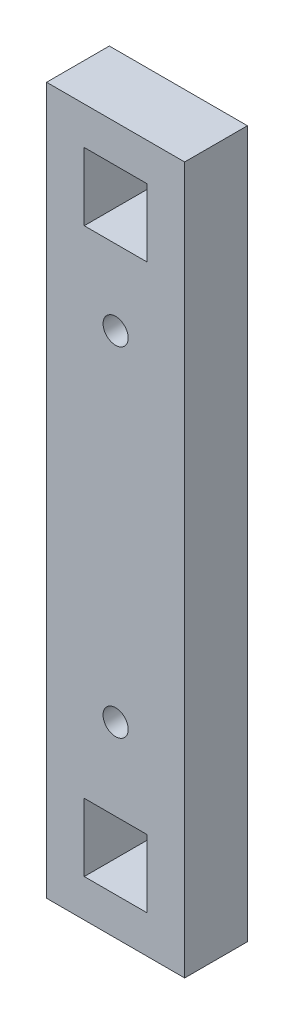
ISO-10303-21;
HEADER;
FILE_DESCRIPTION(('STEP AP214'),'2;1');
FILE_NAME('part.step','',(''),(''),'','','');
FILE_SCHEMA(('AUTOMOTIVE_DESIGN { 1 0 10303 214 1 1 1 1 }'));
ENDSEC;
DATA;
#1=APPLICATION_CONTEXT('core data for automotive mechanical design processes');
#2=APPLICATION_PROTOCOL_DEFINITION('international standard','automotive_design',2000,#1);
#3=PRODUCT_CONTEXT('',#1,'mechanical');
#4=PRODUCT('Part','Part','',(#3));
#5=PRODUCT_RELATED_PRODUCT_CATEGORY('part','',(#4));
#6=PRODUCT_DEFINITION_FORMATION('','',#4);
#7=PRODUCT_DEFINITION_CONTEXT('part definition',#1,'design');
#8=PRODUCT_DEFINITION('design','',#6,#7);
#9=PRODUCT_DEFINITION_SHAPE('','',#8);
#10=(LENGTH_UNIT() NAMED_UNIT(*) SI_UNIT(.MILLI.,.METRE.));
#11=(NAMED_UNIT(*) PLANE_ANGLE_UNIT() SI_UNIT($,.RADIAN.));
#12=(NAMED_UNIT(*) SI_UNIT($,.STERADIAN.) SOLID_ANGLE_UNIT());
#13=UNCERTAINTY_MEASURE_WITH_UNIT(LENGTH_MEASURE(1.E-05),#10,'distance_accuracy_value','');
#14=(GEOMETRIC_REPRESENTATION_CONTEXT(3) GLOBAL_UNCERTAINTY_ASSIGNED_CONTEXT((#13)) GLOBAL_UNIT_ASSIGNED_CONTEXT((#10,
#11,#12)) REPRESENTATION_CONTEXT('',''));
#15=CARTESIAN_POINT('',(0.,0.,0.));
#16=DIRECTION('',(0.,0.,1.));
#17=DIRECTION('',(1.,0.,0.));
#18=AXIS2_PLACEMENT_3D('',#15,#16,#17);
#19=CARTESIAN_POINT('',(0.,0.,5.));
#20=DIRECTION('',(0.,0.,1.));
#21=DIRECTION('',(1.,0.,0.));
#22=AXIS2_PLACEMENT_3D('',#19,#20,#21);
#23=PLANE('',#22);
#24=CARTESIAN_POINT('',(-1.48802211302211,0.659090909090931,5.));
#25=DIRECTION('',(0.,0.,1.));
#26=DIRECTION('',(1.,0.,0.));
#27=AXIS2_PLACEMENT_3D('',#24,#25,#26);
#28=CIRCLE('',#27,1.);
#29=CARTESIAN_POINT('',(-0.488022113022114,0.659090909090931,5.));
#30=VERTEX_POINT('',#29);
#31=EDGE_CURVE('E152',#30,#30,#28,.T.);
#32=ORIENTED_EDGE('',*,*,#31,.F.);
#33=EDGE_LOOP('',(#32));
#34=FACE_BOUND('',#33,.T.);
#35=DIRECTION('',(0.,-1.,0.));
#36=VECTOR('',#35,1.);
#37=CARTESIAN_POINT('',(-6.98802211302212,15.0590909090909,5.));
#38=LINE('',#37,#36);
#39=CARTESIAN_POINT('',(-6.98802211302212,15.0590909090909,5.));
#40=VERTEX_POINT('',#39);
#41=CARTESIAN_POINT('',(-6.98802211302211,-41.2409090909091,5.));
#42=VERTEX_POINT('',#41);
#43=EDGE_CURVE('E193',#40,#42,#38,.T.);
#44=ORIENTED_EDGE('',*,*,#43,.T.);
#45=DIRECTION('',(1.,0.,0.));
#46=VECTOR('',#45,1.);
#47=CARTESIAN_POINT('',(-6.98802211302211,-41.2409090909091,5.));
#48=LINE('',#47,#46);
#49=CARTESIAN_POINT('',(4.01197788697789,-41.2409090909091,5.));
#50=VERTEX_POINT('',#49);
#51=EDGE_CURVE('E196',#42,#50,#48,.T.);
#52=ORIENTED_EDGE('',*,*,#51,.T.);
#53=DIRECTION('',(0.,1.,0.));
#54=VECTOR('',#53,1.);
#55=CARTESIAN_POINT('',(4.01197788697788,15.0590909090909,5.));
#56=LINE('',#55,#54);
#57=CARTESIAN_POINT('',(4.01197788697788,15.0590909090909,5.));
#58=VERTEX_POINT('',#57);
#59=EDGE_CURVE('E199',#50,#58,#56,.T.);
#60=ORIENTED_EDGE('',*,*,#59,.T.);
#61=DIRECTION('',(-1.,0.,0.));
#62=VECTOR('',#61,1.);
#63=CARTESIAN_POINT('',(-6.98802211302212,15.0590909090909,5.));
#64=LINE('',#63,#62);
#65=EDGE_CURVE('E201',#58,#40,#64,.T.);
#66=ORIENTED_EDGE('',*,*,#65,.T.);
#67=EDGE_LOOP('',(#44,#52,#60,#66));
#68=FACE_BOUND('',#67,.T.);
#69=DIRECTION('',(1.,0.,0.));
#70=VECTOR('',#69,1.);
#71=CARTESIAN_POINT('',(-3.98802211302212,6.65909090909093,5.));
#72=LINE('',#71,#70);
#73=CARTESIAN_POINT('',(-3.98802211302212,6.65909090909093,5.));
#74=VERTEX_POINT('',#73);
#75=CARTESIAN_POINT('',(1.01197788697789,6.65909090909093,5.));
#76=VERTEX_POINT('',#75);
#77=EDGE_CURVE('E164',#74,#76,#72,.T.);
#78=ORIENTED_EDGE('',*,*,#77,.F.);
#79=DIRECTION('',(0.,-1.,0.));
#80=VECTOR('',#79,1.);
#81=CARTESIAN_POINT('',(-3.98802211302212,12.0590909090909,5.));
#82=LINE('',#81,#80);
#83=CARTESIAN_POINT('',(-3.98802211302212,12.0590909090909,5.));
#84=VERTEX_POINT('',#83);
#85=EDGE_CURVE('E162',#84,#74,#82,.T.);
#86=ORIENTED_EDGE('',*,*,#85,.F.);
#87=DIRECTION('',(-1.,0.,0.));
#88=VECTOR('',#87,1.);
#89=CARTESIAN_POINT('',(-3.98802211302212,12.0590909090909,5.));
#90=LINE('',#89,#88);
#91=CARTESIAN_POINT('',(1.01197788697788,12.0590909090909,5.));
#92=VERTEX_POINT('',#91);
#93=EDGE_CURVE('E170',#92,#84,#90,.T.);
#94=ORIENTED_EDGE('',*,*,#93,.F.);
#95=DIRECTION('',(0.,1.,0.));
#96=VECTOR('',#95,1.);
#97=CARTESIAN_POINT('',(1.01197788697788,12.0590909090909,5.));
#98=LINE('',#97,#96);
#99=EDGE_CURVE('E167',#76,#92,#98,.T.);
#100=ORIENTED_EDGE('',*,*,#99,.F.);
#101=EDGE_LOOP('',(#78,#86,#94,#100));
#102=FACE_BOUND('',#101,.T.);
#103=DIRECTION('',(1.,0.,0.));
#104=VECTOR('',#103,1.);
#105=CARTESIAN_POINT('',(-3.98802211302211,-38.2409090909091,5.));
#106=LINE('',#105,#104);
#107=CARTESIAN_POINT('',(-3.98802211302211,-38.2409090909091,5.));
#108=VERTEX_POINT('',#107);
#109=CARTESIAN_POINT('',(1.01197788697789,-38.2409090909091,5.));
#110=VERTEX_POINT('',#109);
#111=EDGE_CURVE('E131',#108,#110,#106,.T.);
#112=ORIENTED_EDGE('',*,*,#111,.F.);
#113=DIRECTION('',(0.,-1.,0.));
#114=VECTOR('',#113,1.);
#115=CARTESIAN_POINT('',(-3.98802211302211,-32.8409090909091,5.));
#116=LINE('',#115,#114);
#117=CARTESIAN_POINT('',(-3.98802211302211,-32.8409090909091,5.));
#118=VERTEX_POINT('',#117);
#119=EDGE_CURVE('E123',#118,#108,#116,.T.);
#120=ORIENTED_EDGE('',*,*,#119,.F.);
#121=DIRECTION('',(-1.,0.,0.));
#122=VECTOR('',#121,1.);
#123=CARTESIAN_POINT('',(-3.98802211302211,-32.8409090909091,5.));
#124=LINE('',#123,#122);
#125=CARTESIAN_POINT('',(1.01197788697789,-32.8409090909091,5.));
#126=VERTEX_POINT('',#125);
#127=EDGE_CURVE('E146',#126,#118,#124,.T.);
#128=ORIENTED_EDGE('',*,*,#127,.F.);
#129=DIRECTION('',(0.,1.,0.));
#130=VECTOR('',#129,1.);
#131=CARTESIAN_POINT('',(1.01197788697789,-32.8409090909091,5.));
#132=LINE('',#131,#130);
#133=EDGE_CURVE('E144',#110,#126,#132,.T.);
#134=ORIENTED_EDGE('',*,*,#133,.F.);
#135=EDGE_LOOP('',(#112,#120,#128,#134));
#136=FACE_BOUND('',#135,.T.);
#137=CARTESIAN_POINT('',(-1.48802211302211,-26.3409090909091,5.));
#138=DIRECTION('',(0.,0.,1.));
#139=DIRECTION('',(1.,0.,0.));
#140=AXIS2_PLACEMENT_3D('',#137,#138,#139);
#141=CIRCLE('',#140,1.);
#142=CARTESIAN_POINT('',(-0.48802211302211,-26.3409090909091,5.));
#143=VERTEX_POINT('',#142);
#144=EDGE_CURVE('E310',#143,#143,#141,.T.);
#145=ORIENTED_EDGE('',*,*,#144,.F.);
#146=EDGE_LOOP('',(#145));
#147=FACE_BOUND('',#146,.T.);
#148=ADVANCED_FACE('F34',(#34,#68,#102,#136,#147),#23,.T.);
#149=CARTESIAN_POINT('',(0.,0.,0.));
#150=DIRECTION('',(0.,0.,1.));
#151=DIRECTION('',(1.,0.,0.));
#152=AXIS2_PLACEMENT_3D('',#149,#150,#151);
#153=PLANE('',#152);
#154=DIRECTION('',(0.,-1.,0.));
#155=VECTOR('',#154,1.);
#156=CARTESIAN_POINT('',(-3.98802211302212,12.0590909090909,0.));
#157=LINE('',#156,#155);
#158=CARTESIAN_POINT('',(-3.98802211302212,12.0590909090909,0.));
#159=VERTEX_POINT('',#158);
#160=CARTESIAN_POINT('',(-3.98802211302212,6.65909090909093,0.));
#161=VERTEX_POINT('',#160);
#162=EDGE_CURVE('E139',#159,#161,#157,.T.);
#163=ORIENTED_EDGE('',*,*,#162,.T.);
#164=DIRECTION('',(1.,0.,0.));
#165=VECTOR('',#164,1.);
#166=CARTESIAN_POINT('',(-3.98802211302212,6.65909090909093,0.));
#167=LINE('',#166,#165);
#168=CARTESIAN_POINT('',(1.01197788697789,6.65909090909093,0.));
#169=VERTEX_POINT('',#168);
#170=EDGE_CURVE('E175',#161,#169,#167,.T.);
#171=ORIENTED_EDGE('',*,*,#170,.T.);
#172=DIRECTION('',(0.,1.,0.));
#173=VECTOR('',#172,1.);
#174=CARTESIAN_POINT('',(1.01197788697788,12.0590909090909,0.));
#175=LINE('',#174,#173);
#176=CARTESIAN_POINT('',(1.01197788697788,12.0590909090909,0.));
#177=VERTEX_POINT('',#176);
#178=EDGE_CURVE('E178',#169,#177,#175,.T.);
#179=ORIENTED_EDGE('',*,*,#178,.T.);
#180=DIRECTION('',(-1.,0.,0.));
#181=VECTOR('',#180,1.);
#182=CARTESIAN_POINT('',(-3.98802211302212,12.0590909090909,0.));
#183=LINE('',#182,#181);
#184=EDGE_CURVE('E165',#177,#159,#183,.T.);
#185=ORIENTED_EDGE('',*,*,#184,.T.);
#186=EDGE_LOOP('',(#163,#171,#179,#185));
#187=FACE_BOUND('',#186,.T.);
#188=DIRECTION('',(0.,-1.,0.));
#189=VECTOR('',#188,1.);
#190=CARTESIAN_POINT('',(-6.98802211302212,15.0590909090909,0.));
#191=LINE('',#190,#189);
#192=CARTESIAN_POINT('',(-6.98802211302212,15.0590909090909,0.));
#193=VERTEX_POINT('',#192);
#194=CARTESIAN_POINT('',(-6.98802211302211,-41.2409090909091,0.));
#195=VERTEX_POINT('',#194);
#196=EDGE_CURVE('E192',#193,#195,#191,.T.);
#197=ORIENTED_EDGE('',*,*,#196,.F.);
#198=DIRECTION('',(-1.,0.,0.));
#199=VECTOR('',#198,1.);
#200=CARTESIAN_POINT('',(-6.98802211302212,15.0590909090909,0.));
#201=LINE('',#200,#199);
#202=CARTESIAN_POINT('',(4.01197788697788,15.0590909090909,0.));
#203=VERTEX_POINT('',#202);
#204=EDGE_CURVE('E197',#203,#193,#201,.T.);
#205=ORIENTED_EDGE('',*,*,#204,.F.);
#206=DIRECTION('',(0.,1.,0.));
#207=VECTOR('',#206,1.);
#208=CARTESIAN_POINT('',(4.01197788697788,15.0590909090909,0.));
#209=LINE('',#208,#207);
#210=CARTESIAN_POINT('',(4.01197788697789,-41.2409090909091,0.));
#211=VERTEX_POINT('',#210);
#212=EDGE_CURVE('E208',#211,#203,#209,.T.);
#213=ORIENTED_EDGE('',*,*,#212,.F.);
#214=DIRECTION('',(1.,0.,0.));
#215=VECTOR('',#214,1.);
#216=CARTESIAN_POINT('',(-6.98802211302211,-41.2409090909091,0.));
#217=LINE('',#216,#215);
#218=EDGE_CURVE('E206',#195,#211,#217,.T.);
#219=ORIENTED_EDGE('',*,*,#218,.F.);
#220=EDGE_LOOP('',(#197,#205,#213,#219));
#221=FACE_BOUND('',#220,.T.);
#222=DIRECTION('',(0.,-1.,0.));
#223=VECTOR('',#222,1.);
#224=CARTESIAN_POINT('',(-3.98802211302211,-32.8409090909091,0.));
#225=LINE('',#224,#223);
#226=CARTESIAN_POINT('',(-3.98802211302211,-32.8409090909091,0.));
#227=VERTEX_POINT('',#226);
#228=CARTESIAN_POINT('',(-3.98802211302211,-38.2409090909091,0.));
#229=VERTEX_POINT('',#228);
#230=EDGE_CURVE('E57',#227,#229,#225,.T.);
#231=ORIENTED_EDGE('',*,*,#230,.T.);
#232=DIRECTION('',(1.,0.,0.));
#233=VECTOR('',#232,1.);
#234=CARTESIAN_POINT('',(-3.98802211302211,-38.2409090909091,0.));
#235=LINE('',#234,#233);
#236=CARTESIAN_POINT('',(1.01197788697789,-38.2409090909091,0.));
#237=VERTEX_POINT('',#236);
#238=EDGE_CURVE('E138',#229,#237,#235,.T.);
#239=ORIENTED_EDGE('',*,*,#238,.T.);
#240=DIRECTION('',(0.,1.,0.));
#241=VECTOR('',#240,1.);
#242=CARTESIAN_POINT('',(1.01197788697789,-32.8409090909091,0.));
#243=LINE('',#242,#241);
#244=CARTESIAN_POINT('',(1.01197788697789,-32.8409090909091,0.));
#245=VERTEX_POINT('',#244);
#246=EDGE_CURVE('E154',#237,#245,#243,.T.);
#247=ORIENTED_EDGE('',*,*,#246,.T.);
#248=DIRECTION('',(-1.,0.,0.));
#249=VECTOR('',#248,1.);
#250=CARTESIAN_POINT('',(-3.98802211302211,-32.8409090909091,0.));
#251=LINE('',#250,#249);
#252=EDGE_CURVE('E132',#245,#227,#251,.T.);
#253=ORIENTED_EDGE('',*,*,#252,.T.);
#254=EDGE_LOOP('',(#231,#239,#247,#253));
#255=FACE_BOUND('',#254,.T.);
#256=CARTESIAN_POINT('',(-1.48802211302211,0.659090909090931,0.));
#257=DIRECTION('',(0.,0.,1.));
#258=DIRECTION('',(1.,0.,0.));
#259=AXIS2_PLACEMENT_3D('',#256,#257,#258);
#260=CIRCLE('',#259,1.);
#261=CARTESIAN_POINT('',(-0.488022113022114,0.659090909090931,0.));
#262=VERTEX_POINT('',#261);
#263=EDGE_CURVE('E316',#262,#262,#260,.T.);
#264=ORIENTED_EDGE('',*,*,#263,.T.);
#265=EDGE_LOOP('',(#264));
#266=FACE_BOUND('',#265,.T.);
#267=CARTESIAN_POINT('',(-1.48802211302211,-26.3409090909091,0.));
#268=DIRECTION('',(0.,0.,1.));
#269=DIRECTION('',(1.,0.,0.));
#270=AXIS2_PLACEMENT_3D('',#267,#268,#269);
#271=CIRCLE('',#270,1.);
#272=CARTESIAN_POINT('',(-0.48802211302211,-26.3409090909091,0.));
#273=VERTEX_POINT('',#272);
#274=EDGE_CURVE('E313',#273,#273,#271,.T.);
#275=ORIENTED_EDGE('',*,*,#274,.T.);
#276=EDGE_LOOP('',(#275));
#277=FACE_BOUND('',#276,.T.);
#278=ADVANCED_FACE('F226',(#187,#221,#255,#266,#277),#153,.F.);
#279=CARTESIAN_POINT('',(-6.98802211302212,15.0590909090909,5.));
#280=DIRECTION('',(1.,0.,0.));
#281=DIRECTION('',(0.,1.,0.));
#282=AXIS2_PLACEMENT_3D('',#279,#280,#281);
#283=PLANE('',#282);
#284=ORIENTED_EDGE('',*,*,#196,.T.);
#285=DIRECTION('',(0.,0.,-1.));
#286=VECTOR('',#285,1.);
#287=CARTESIAN_POINT('',(-6.98802211302211,-41.2409090909091,5.));
#288=LINE('',#287,#286);
#289=EDGE_CURVE('E11',#42,#195,#288,.T.);
#290=ORIENTED_EDGE('',*,*,#289,.F.);
#291=ORIENTED_EDGE('',*,*,#43,.F.);
#292=DIRECTION('',(0.,0.,-1.));
#293=VECTOR('',#292,1.);
#294=CARTESIAN_POINT('',(-6.98802211302212,15.0590909090909,5.));
#295=LINE('',#294,#293);
#296=EDGE_CURVE('E203',#40,#193,#295,.T.);
#297=ORIENTED_EDGE('',*,*,#296,.T.);
#298=EDGE_LOOP('',(#284,#290,#291,#297));
#299=FACE_BOUND('',#298,.T.);
#300=ADVANCED_FACE('F36',(#299),#283,.F.);
#301=CARTESIAN_POINT('',(-6.98802211302211,-41.2409090909091,5.));
#302=DIRECTION('',(0.,1.,0.));
#303=DIRECTION('',(0.,0.,1.));
#304=AXIS2_PLACEMENT_3D('',#301,#302,#303);
#305=PLANE('',#304);
#306=ORIENTED_EDGE('',*,*,#218,.T.);
#307=DIRECTION('',(0.,0.,-1.));
#308=VECTOR('',#307,1.);
#309=CARTESIAN_POINT('',(4.01197788697789,-41.2409090909091,5.));
#310=LINE('',#309,#308);
#311=EDGE_CURVE('E42',#50,#211,#310,.T.);
#312=ORIENTED_EDGE('',*,*,#311,.F.);
#313=ORIENTED_EDGE('',*,*,#51,.F.);
#314=ORIENTED_EDGE('',*,*,#289,.T.);
#315=EDGE_LOOP('',(#306,#312,#313,#314));
#316=FACE_BOUND('',#315,.T.);
#317=ADVANCED_FACE('F237',(#316),#305,.F.);
#318=CARTESIAN_POINT('',(4.01197788697788,15.0590909090909,5.));
#319=DIRECTION('',(-1.,0.,0.));
#320=DIRECTION('',(0.,-1.,0.));
#321=AXIS2_PLACEMENT_3D('',#318,#319,#320);
#322=PLANE('',#321);
#323=ORIENTED_EDGE('',*,*,#212,.T.);
#324=DIRECTION('',(0.,0.,-1.));
#325=VECTOR('',#324,1.);
#326=CARTESIAN_POINT('',(4.01197788697788,15.0590909090909,5.));
#327=LINE('',#326,#325);
#328=EDGE_CURVE('E213',#58,#203,#327,.T.);
#329=ORIENTED_EDGE('',*,*,#328,.F.);
#330=ORIENTED_EDGE('',*,*,#59,.F.);
#331=ORIENTED_EDGE('',*,*,#311,.T.);
#332=EDGE_LOOP('',(#323,#329,#330,#331));
#333=FACE_BOUND('',#332,.T.);
#334=ADVANCED_FACE('F220',(#333),#322,.F.);
#335=CARTESIAN_POINT('',(-6.98802211302212,15.0590909090909,5.));
#336=DIRECTION('',(0.,-1.,0.));
#337=DIRECTION('',(0.,0.,-1.));
#338=AXIS2_PLACEMENT_3D('',#335,#336,#337);
#339=PLANE('',#338);
#340=ORIENTED_EDGE('',*,*,#204,.T.);
#341=ORIENTED_EDGE('',*,*,#296,.F.);
#342=ORIENTED_EDGE('',*,*,#65,.F.);
#343=ORIENTED_EDGE('',*,*,#328,.T.);
#344=EDGE_LOOP('',(#340,#341,#342,#343));
#345=FACE_BOUND('',#344,.T.);
#346=ADVANCED_FACE('F230',(#345),#339,.F.);
#347=CARTESIAN_POINT('',(-3.98802211302212,12.0590909090909,5.));
#348=DIRECTION('',(1.,0.,0.));
#349=DIRECTION('',(0.,1.,0.));
#350=AXIS2_PLACEMENT_3D('',#347,#348,#349);
#351=PLANE('',#350);
#352=ORIENTED_EDGE('',*,*,#162,.F.);
#353=DIRECTION('',(0.,0.,-1.));
#354=VECTOR('',#353,1.);
#355=CARTESIAN_POINT('',(-3.98802211302212,12.0590909090909,5.));
#356=LINE('',#355,#354);
#357=EDGE_CURVE('E172',#84,#159,#356,.T.);
#358=ORIENTED_EDGE('',*,*,#357,.F.);
#359=ORIENTED_EDGE('',*,*,#85,.T.);
#360=DIRECTION('',(0.,0.,-1.));
#361=VECTOR('',#360,1.);
#362=CARTESIAN_POINT('',(-3.98802211302212,6.65909090909093,5.));
#363=LINE('',#362,#361);
#364=EDGE_CURVE('E189',#74,#161,#363,.T.);
#365=ORIENTED_EDGE('',*,*,#364,.T.);
#366=EDGE_LOOP('',(#352,#358,#359,#365));
#367=FACE_BOUND('',#366,.T.);
#368=ADVANCED_FACE('F254',(#367),#351,.T.);
#369=CARTESIAN_POINT('',(-3.98802211302212,6.65909090909093,5.));
#370=DIRECTION('',(0.,1.,0.));
#371=DIRECTION('',(0.,0.,1.));
#372=AXIS2_PLACEMENT_3D('',#369,#370,#371);
#373=PLANE('',#372);
#374=ORIENTED_EDGE('',*,*,#170,.F.);
#375=ORIENTED_EDGE('',*,*,#364,.F.);
#376=ORIENTED_EDGE('',*,*,#77,.T.);
#377=DIRECTION('',(0.,0.,-1.));
#378=VECTOR('',#377,1.);
#379=CARTESIAN_POINT('',(1.01197788697789,6.65909090909093,5.));
#380=LINE('',#379,#378);
#381=EDGE_CURVE('E187',#76,#169,#380,.T.);
#382=ORIENTED_EDGE('',*,*,#381,.T.);
#383=EDGE_LOOP('',(#374,#375,#376,#382));
#384=FACE_BOUND('',#383,.T.);
#385=ADVANCED_FACE('F261',(#384),#373,.T.);
#386=CARTESIAN_POINT('',(1.01197788697788,12.0590909090909,5.));
#387=DIRECTION('',(-1.,0.,0.));
#388=DIRECTION('',(0.,-1.,0.));
#389=AXIS2_PLACEMENT_3D('',#386,#387,#388);
#390=PLANE('',#389);
#391=ORIENTED_EDGE('',*,*,#178,.F.);
#392=ORIENTED_EDGE('',*,*,#381,.F.);
#393=ORIENTED_EDGE('',*,*,#99,.T.);
#394=DIRECTION('',(0.,0.,-1.));
#395=VECTOR('',#394,1.);
#396=CARTESIAN_POINT('',(1.01197788697788,12.0590909090909,5.));
#397=LINE('',#396,#395);
#398=EDGE_CURVE('E185',#92,#177,#397,.T.);
#399=ORIENTED_EDGE('',*,*,#398,.T.);
#400=EDGE_LOOP('',(#391,#392,#393,#399));
#401=FACE_BOUND('',#400,.T.);
#402=ADVANCED_FACE('F266',(#401),#390,.T.);
#403=CARTESIAN_POINT('',(-3.98802211302212,12.0590909090909,5.));
#404=DIRECTION('',(0.,-1.,0.));
#405=DIRECTION('',(0.,0.,-1.));
#406=AXIS2_PLACEMENT_3D('',#403,#404,#405);
#407=PLANE('',#406);
#408=ORIENTED_EDGE('',*,*,#184,.F.);
#409=ORIENTED_EDGE('',*,*,#398,.F.);
#410=ORIENTED_EDGE('',*,*,#93,.T.);
#411=ORIENTED_EDGE('',*,*,#357,.T.);
#412=EDGE_LOOP('',(#408,#409,#410,#411));
#413=FACE_BOUND('',#412,.T.);
#414=ADVANCED_FACE('F273',(#413),#407,.T.);
#415=CARTESIAN_POINT('',(-3.98802211302211,-32.8409090909091,5.));
#416=DIRECTION('',(1.,0.,0.));
#417=DIRECTION('',(0.,1.,0.));
#418=AXIS2_PLACEMENT_3D('',#415,#416,#417);
#419=PLANE('',#418);
#420=ORIENTED_EDGE('',*,*,#230,.F.);
#421=DIRECTION('',(0.,0.,-1.));
#422=VECTOR('',#421,1.);
#423=CARTESIAN_POINT('',(-3.98802211302211,-32.8409090909091,5.));
#424=LINE('',#423,#422);
#425=EDGE_CURVE('E127',#118,#227,#424,.T.);
#426=ORIENTED_EDGE('',*,*,#425,.F.);
#427=ORIENTED_EDGE('',*,*,#119,.T.);
#428=DIRECTION('',(0.,0.,-1.));
#429=VECTOR('',#428,1.);
#430=CARTESIAN_POINT('',(-3.98802211302211,-38.2409090909091,5.));
#431=LINE('',#430,#429);
#432=EDGE_CURVE('E126',#108,#229,#431,.T.);
#433=ORIENTED_EDGE('',*,*,#432,.T.);
#434=EDGE_LOOP('',(#420,#426,#427,#433));
#435=FACE_BOUND('',#434,.T.);
#436=ADVANCED_FACE('F125',(#435),#419,.T.);
#437=CARTESIAN_POINT('',(-3.98802211302211,-38.2409090909091,5.));
#438=DIRECTION('',(0.,1.,0.));
#439=DIRECTION('',(0.,0.,1.));
#440=AXIS2_PLACEMENT_3D('',#437,#438,#439);
#441=PLANE('',#440);
#442=ORIENTED_EDGE('',*,*,#238,.F.);
#443=ORIENTED_EDGE('',*,*,#432,.F.);
#444=ORIENTED_EDGE('',*,*,#111,.T.);
#445=DIRECTION('',(0.,0.,-1.));
#446=VECTOR('',#445,1.);
#447=CARTESIAN_POINT('',(1.01197788697789,-38.2409090909091,5.));
#448=LINE('',#447,#446);
#449=EDGE_CURVE('E140',#110,#237,#448,.T.);
#450=ORIENTED_EDGE('',*,*,#449,.T.);
#451=EDGE_LOOP('',(#442,#443,#444,#450));
#452=FACE_BOUND('',#451,.T.);
#453=ADVANCED_FACE('F135',(#452),#441,.T.);
#454=CARTESIAN_POINT('',(1.01197788697789,-32.8409090909091,5.));
#455=DIRECTION('',(-1.,0.,0.));
#456=DIRECTION('',(0.,-1.,0.));
#457=AXIS2_PLACEMENT_3D('',#454,#455,#456);
#458=PLANE('',#457);
#459=ORIENTED_EDGE('',*,*,#246,.F.);
#460=ORIENTED_EDGE('',*,*,#449,.F.);
#461=ORIENTED_EDGE('',*,*,#133,.T.);
#462=DIRECTION('',(0.,0.,-1.));
#463=VECTOR('',#462,1.);
#464=CARTESIAN_POINT('',(1.01197788697789,-32.8409090909091,5.));
#465=LINE('',#464,#463);
#466=EDGE_CURVE('E49',#126,#245,#465,.T.);
#467=ORIENTED_EDGE('',*,*,#466,.T.);
#468=EDGE_LOOP('',(#459,#460,#461,#467));
#469=FACE_BOUND('',#468,.T.);
#470=ADVANCED_FACE('F291',(#469),#458,.T.);
#471=CARTESIAN_POINT('',(-3.98802211302211,-32.8409090909091,5.));
#472=DIRECTION('',(0.,-1.,0.));
#473=DIRECTION('',(0.,0.,-1.));
#474=AXIS2_PLACEMENT_3D('',#471,#472,#473);
#475=PLANE('',#474);
#476=ORIENTED_EDGE('',*,*,#252,.F.);
#477=ORIENTED_EDGE('',*,*,#466,.F.);
#478=ORIENTED_EDGE('',*,*,#127,.T.);
#479=ORIENTED_EDGE('',*,*,#425,.T.);
#480=EDGE_LOOP('',(#476,#477,#478,#479));
#481=FACE_BOUND('',#480,.T.);
#482=ADVANCED_FACE('F294',(#481),#475,.T.);
#483=CARTESIAN_POINT('',(-1.48802211302211,0.659090909090931,5.));
#484=DIRECTION('',(0.,0.,-1.));
#485=DIRECTION('',(-1.,0.,0.));
#486=AXIS2_PLACEMENT_3D('',#483,#484,#485);
#487=CYLINDRICAL_SURFACE('',#486,1.);
#488=ORIENTED_EDGE('',*,*,#31,.T.);
#489=EDGE_LOOP('',(#488));
#490=FACE_BOUND('',#489,.T.);
#491=ORIENTED_EDGE('',*,*,#263,.F.);
#492=EDGE_LOOP('',(#491));
#493=FACE_BOUND('',#492,.T.);
#494=ADVANCED_FACE('F298',(#490,#493),#487,.F.);
#495=CARTESIAN_POINT('',(-1.48802211302211,-26.3409090909091,5.));
#496=DIRECTION('',(0.,0.,-1.));
#497=DIRECTION('',(-1.,0.,0.));
#498=AXIS2_PLACEMENT_3D('',#495,#496,#497);
#499=CYLINDRICAL_SURFACE('',#498,1.);
#500=ORIENTED_EDGE('',*,*,#144,.T.);
#501=EDGE_LOOP('',(#500));
#502=FACE_BOUND('',#501,.T.);
#503=ORIENTED_EDGE('',*,*,#274,.F.);
#504=EDGE_LOOP('',(#503));
#505=FACE_BOUND('',#504,.T.);
#506=ADVANCED_FACE('F301',(#502,#505),#499,.F.);
#507=CLOSED_SHELL('',(#148,#278,#300,#317,#334,#346,#368,#385,#402,#414,#436,#453,#470,#482,
#494,#506));
#508=MANIFOLD_SOLID_BREP('B2',#507);
#509=ADVANCED_BREP_SHAPE_REPRESENTATION('',(#18,#508),#14);
#510=SHAPE_DEFINITION_REPRESENTATION(#9,#509);
ENDSEC;
END-ISO-10303-21;
